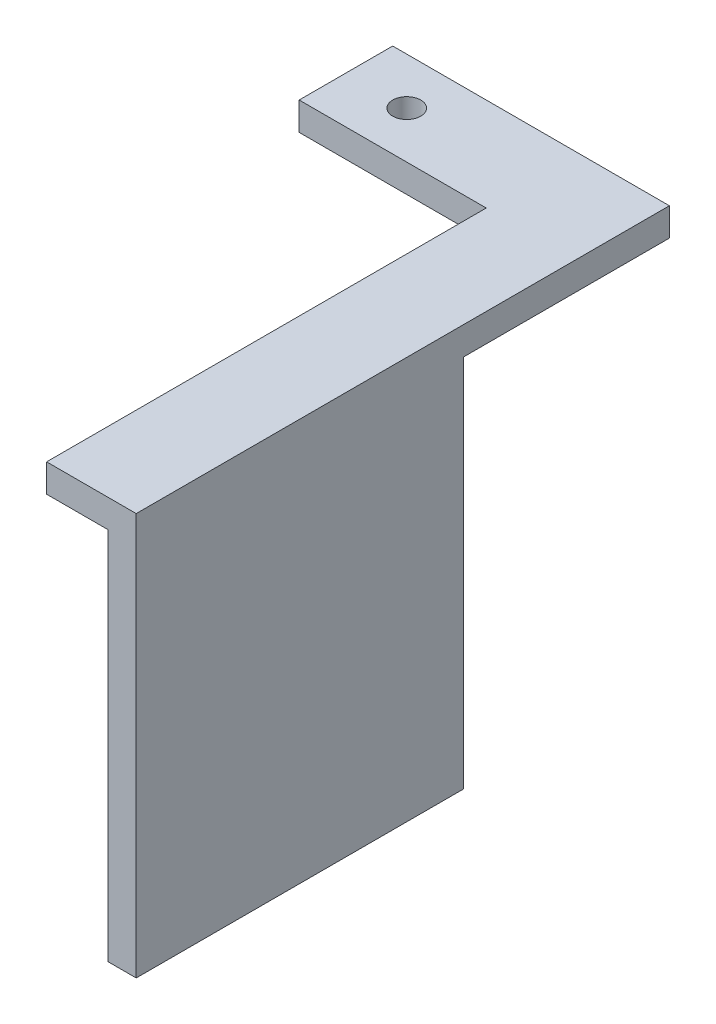
ISO-10303-21;
HEADER;
FILE_DESCRIPTION(('STEP AP214'),'2;1');
FILE_NAME('part.step','',(''),(''),'','','');
FILE_SCHEMA(('AUTOMOTIVE_DESIGN { 1 0 10303 214 1 1 1 1 }'));
ENDSEC;
DATA;
#1=APPLICATION_CONTEXT('core data for automotive mechanical design processes');
#2=APPLICATION_PROTOCOL_DEFINITION('international standard','automotive_design',2000,#1);
#3=PRODUCT_CONTEXT('',#1,'mechanical');
#4=PRODUCT('Part','Part','',(#3));
#5=PRODUCT_RELATED_PRODUCT_CATEGORY('part','',(#4));
#6=PRODUCT_DEFINITION_FORMATION('','',#4);
#7=PRODUCT_DEFINITION_CONTEXT('part definition',#1,'design');
#8=PRODUCT_DEFINITION('design','',#6,#7);
#9=PRODUCT_DEFINITION_SHAPE('','',#8);
#10=(LENGTH_UNIT() NAMED_UNIT(*) SI_UNIT(.MILLI.,.METRE.));
#11=(NAMED_UNIT(*) PLANE_ANGLE_UNIT() SI_UNIT($,.RADIAN.));
#12=(NAMED_UNIT(*) SI_UNIT($,.STERADIAN.) SOLID_ANGLE_UNIT());
#13=UNCERTAINTY_MEASURE_WITH_UNIT(LENGTH_MEASURE(1.E-05),#10,'distance_accuracy_value','');
#14=(GEOMETRIC_REPRESENTATION_CONTEXT(3) GLOBAL_UNCERTAINTY_ASSIGNED_CONTEXT((#13)) GLOBAL_UNIT_ASSIGNED_CONTEXT((#10,
#11,#12)) REPRESENTATION_CONTEXT('',''));
#15=CARTESIAN_POINT('',(0.,0.,0.));
#16=DIRECTION('',(0.,0.,1.));
#17=DIRECTION('',(1.,0.,0.));
#18=AXIS2_PLACEMENT_3D('',#15,#16,#17);
#19=CARTESIAN_POINT('',(0.,0.,0.));
#20=DIRECTION('',(0.,1.,0.));
#21=DIRECTION('',(0.,0.,1.));
#22=AXIS2_PLACEMENT_3D('',#19,#20,#21);
#23=PLANE('',#22);
#24=CARTESIAN_POINT('',(-3.5,0.,0.));
#25=DIRECTION('',(0.,1.,0.));
#26=DIRECTION('',(0.,0.,1.));
#27=AXIS2_PLACEMENT_3D('',#24,#25,#26);
#28=CIRCLE('',#27,1.5);
#29=CARTESIAN_POINT('',(-3.5,0.,1.5));
#30=VERTEX_POINT('',#29);
#31=EDGE_CURVE('E131',#30,#30,#28,.T.);
#32=ORIENTED_EDGE('',*,*,#31,.T.);
#33=EDGE_LOOP('',(#32));
#34=FACE_BOUND('',#33,.T.);
#35=DIRECTION('',(0.,0.,-1.));
#36=VECTOR('',#35,1.);
#37=CARTESIAN_POINT('',(16.57850172,0.,17.));
#38=LINE('',#37,#36);
#39=CARTESIAN_POINT('',(16.57850172,0.,52.));
#40=VERTEX_POINT('',#39);
#41=CARTESIAN_POINT('',(16.57850172,0.,17.));
#42=VERTEX_POINT('',#41);
#43=EDGE_CURVE('E56',#40,#42,#38,.T.);
#44=ORIENTED_EDGE('',*,*,#43,.F.);
#45=DIRECTION('',(1.,0.,0.));
#46=VECTOR('',#45,1.);
#47=CARTESIAN_POINT('',(10.,0.,52.));
#48=LINE('',#47,#46);
#49=CARTESIAN_POINT('',(10.,0.,52.));
#50=VERTEX_POINT('',#49);
#51=EDGE_CURVE('E161',#50,#40,#48,.T.);
#52=ORIENTED_EDGE('',*,*,#51,.F.);
#53=DIRECTION('',(0.,0.,1.));
#54=VECTOR('',#53,1.);
#55=CARTESIAN_POINT('',(10.,0.,5.));
#56=LINE('',#55,#54);
#57=CARTESIAN_POINT('',(10.,0.,5.));
#58=VERTEX_POINT('',#57);
#59=EDGE_CURVE('E159',#58,#50,#56,.T.);
#60=ORIENTED_EDGE('',*,*,#59,.F.);
#61=DIRECTION('',(1.,0.,0.));
#62=VECTOR('',#61,1.);
#63=CARTESIAN_POINT('',(10.,0.,5.));
#64=LINE('',#63,#62);
#65=CARTESIAN_POINT('',(-10.,0.,5.));
#66=VERTEX_POINT('',#65);
#67=EDGE_CURVE('E157',#66,#58,#64,.T.);
#68=ORIENTED_EDGE('',*,*,#67,.F.);
#69=DIRECTION('',(0.,0.,1.));
#70=VECTOR('',#69,1.);
#71=CARTESIAN_POINT('',(-10.,0.,5.));
#72=LINE('',#71,#70);
#73=CARTESIAN_POINT('',(-10.,0.,-5.));
#74=VERTEX_POINT('',#73);
#75=EDGE_CURVE('E138',#74,#66,#72,.T.);
#76=ORIENTED_EDGE('',*,*,#75,.F.);
#77=DIRECTION('',(-1.,0.,0.));
#78=VECTOR('',#77,1.);
#79=CARTESIAN_POINT('',(10.,0.,-5.));
#80=LINE('',#79,#78);
#81=CARTESIAN_POINT('',(19.57850172,0.,-5.));
#82=VERTEX_POINT('',#81);
#83=EDGE_CURVE('E144',#82,#74,#80,.T.);
#84=ORIENTED_EDGE('',*,*,#83,.F.);
#85=DIRECTION('',(0.,0.,-1.));
#86=VECTOR('',#85,1.);
#87=CARTESIAN_POINT('',(19.57850172,0.,52.));
#88=LINE('',#87,#86);
#89=CARTESIAN_POINT('',(19.57850172,0.,17.));
#90=VERTEX_POINT('',#89);
#91=EDGE_CURVE('E163',#90,#82,#88,.T.);
#92=ORIENTED_EDGE('',*,*,#91,.F.);
#93=DIRECTION('',(1.,0.,0.));
#94=VECTOR('',#93,1.);
#95=CARTESIAN_POINT('',(19.57850172,0.,17.));
#96=LINE('',#95,#94);
#97=EDGE_CURVE('E51',#42,#90,#96,.T.);
#98=ORIENTED_EDGE('',*,*,#97,.F.);
#99=EDGE_LOOP('',(#44,#52,#60,#68,#76,#84,#92,#98));
#100=FACE_BOUND('',#99,.T.);
#101=ADVANCED_FACE('F36',(#34,#100),#23,.F.);
#102=CARTESIAN_POINT('',(-10.,3.,5.));
#103=DIRECTION('',(1.,0.,0.));
#104=DIRECTION('',(0.,0.,-1.));
#105=AXIS2_PLACEMENT_3D('',#102,#103,#104);
#106=PLANE('',#105);
#107=ORIENTED_EDGE('',*,*,#75,.T.);
#108=DIRECTION('',(0.,-1.,0.));
#109=VECTOR('',#108,1.);
#110=CARTESIAN_POINT('',(-10.,3.,5.));
#111=LINE('',#110,#109);
#112=CARTESIAN_POINT('',(-10.,3.,5.));
#113=VERTEX_POINT('',#112);
#114=EDGE_CURVE('E11',#113,#66,#111,.T.);
#115=ORIENTED_EDGE('',*,*,#114,.F.);
#116=DIRECTION('',(0.,0.,1.));
#117=VECTOR('',#116,1.);
#118=CARTESIAN_POINT('',(-10.,3.,5.));
#119=LINE('',#118,#117);
#120=CARTESIAN_POINT('',(-10.,3.,-5.));
#121=VERTEX_POINT('',#120);
#122=EDGE_CURVE('E140',#121,#113,#119,.T.);
#123=ORIENTED_EDGE('',*,*,#122,.F.);
#124=DIRECTION('',(0.,-1.,0.));
#125=VECTOR('',#124,1.);
#126=CARTESIAN_POINT('',(-10.,3.,-5.));
#127=LINE('',#126,#125);
#128=EDGE_CURVE('E154',#121,#74,#127,.T.);
#129=ORIENTED_EDGE('',*,*,#128,.T.);
#130=EDGE_LOOP('',(#107,#115,#123,#129));
#131=FACE_BOUND('',#130,.T.);
#132=ADVANCED_FACE('F38',(#131),#106,.F.);
#133=CARTESIAN_POINT('',(10.,3.,5.));
#134=DIRECTION('',(0.,0.,-1.));
#135=DIRECTION('',(-1.,0.,0.));
#136=AXIS2_PLACEMENT_3D('',#133,#134,#135);
#137=PLANE('',#136);
#138=ORIENTED_EDGE('',*,*,#67,.T.);
#139=DIRECTION('',(0.,-1.,0.));
#140=VECTOR('',#139,1.);
#141=CARTESIAN_POINT('',(10.,3.,5.));
#142=LINE('',#141,#140);
#143=CARTESIAN_POINT('',(10.,3.,5.));
#144=VERTEX_POINT('',#143);
#145=EDGE_CURVE('E44',#144,#58,#142,.T.);
#146=ORIENTED_EDGE('',*,*,#145,.F.);
#147=DIRECTION('',(1.,0.,0.));
#148=VECTOR('',#147,1.);
#149=CARTESIAN_POINT('',(10.,3.,5.));
#150=LINE('',#149,#148);
#151=EDGE_CURVE('E143',#113,#144,#150,.T.);
#152=ORIENTED_EDGE('',*,*,#151,.F.);
#153=ORIENTED_EDGE('',*,*,#114,.T.);
#154=EDGE_LOOP('',(#138,#146,#152,#153));
#155=FACE_BOUND('',#154,.T.);
#156=ADVANCED_FACE('F202',(#155),#137,.F.);
#157=CARTESIAN_POINT('',(10.,3.,5.));
#158=DIRECTION('',(1.,0.,0.));
#159=DIRECTION('',(0.,0.,-1.));
#160=AXIS2_PLACEMENT_3D('',#157,#158,#159);
#161=PLANE('',#160);
#162=ORIENTED_EDGE('',*,*,#59,.T.);
#163=DIRECTION('',(0.,-1.,0.));
#164=VECTOR('',#163,1.);
#165=CARTESIAN_POINT('',(10.,3.,52.));
#166=LINE('',#165,#164);
#167=CARTESIAN_POINT('',(10.,3.,52.));
#168=VERTEX_POINT('',#167);
#169=EDGE_CURVE('E173',#168,#50,#166,.T.);
#170=ORIENTED_EDGE('',*,*,#169,.F.);
#171=DIRECTION('',(0.,0.,1.));
#172=VECTOR('',#171,1.);
#173=CARTESIAN_POINT('',(10.,3.,5.));
#174=LINE('',#173,#172);
#175=EDGE_CURVE('E146',#144,#168,#174,.T.);
#176=ORIENTED_EDGE('',*,*,#175,.F.);
#177=ORIENTED_EDGE('',*,*,#145,.T.);
#178=EDGE_LOOP('',(#162,#170,#176,#177));
#179=FACE_BOUND('',#178,.T.);
#180=ADVANCED_FACE('F180',(#179),#161,.F.);
#181=CARTESIAN_POINT('',(10.,3.,52.));
#182=DIRECTION('',(0.,0.,-1.));
#183=DIRECTION('',(-1.,0.,0.));
#184=AXIS2_PLACEMENT_3D('',#181,#182,#183);
#185=PLANE('',#184);
#186=ORIENTED_EDGE('',*,*,#51,.T.);
#187=DIRECTION('',(0.,1.,0.));
#188=VECTOR('',#187,1.);
#189=CARTESIAN_POINT('',(16.57850172,-40.,52.));
#190=LINE('',#189,#188);
#191=CARTESIAN_POINT('',(16.57850172,-40.,52.));
#192=VERTEX_POINT('',#191);
#193=EDGE_CURVE('E133',#192,#40,#190,.T.);
#194=ORIENTED_EDGE('',*,*,#193,.F.);
#195=DIRECTION('',(-1.,0.,0.));
#196=VECTOR('',#195,1.);
#197=CARTESIAN_POINT('',(19.57850172,-40.,52.));
#198=LINE('',#197,#196);
#199=CARTESIAN_POINT('',(19.57850172,-40.,52.));
#200=VERTEX_POINT('',#199);
#201=EDGE_CURVE('E122',#200,#192,#198,.T.);
#202=ORIENTED_EDGE('',*,*,#201,.F.);
#203=DIRECTION('',(0.,-1.,0.));
#204=VECTOR('',#203,1.);
#205=CARTESIAN_POINT('',(19.57850172,3.,52.));
#206=LINE('',#205,#204);
#207=CARTESIAN_POINT('',(19.57850172,3.,52.));
#208=VERTEX_POINT('',#207);
#209=EDGE_CURVE('E171',#208,#200,#206,.T.);
#210=ORIENTED_EDGE('',*,*,#209,.F.);
#211=DIRECTION('',(1.,0.,0.));
#212=VECTOR('',#211,1.);
#213=CARTESIAN_POINT('',(10.,3.,52.));
#214=LINE('',#213,#212);
#215=EDGE_CURVE('E148',#168,#208,#214,.T.);
#216=ORIENTED_EDGE('',*,*,#215,.F.);
#217=ORIENTED_EDGE('',*,*,#169,.T.);
#218=EDGE_LOOP('',(#186,#194,#202,#210,#216,#217));
#219=FACE_BOUND('',#218,.T.);
#220=ADVANCED_FACE('F185',(#219),#185,.F.);
#221=CARTESIAN_POINT('',(19.57850172,3.,52.));
#222=DIRECTION('',(-1.,0.,0.));
#223=DIRECTION('',(0.,0.,1.));
#224=AXIS2_PLACEMENT_3D('',#221,#222,#223);
#225=PLANE('',#224);
#226=ORIENTED_EDGE('',*,*,#209,.T.);
#227=DIRECTION('',(0.,0.,1.));
#228=VECTOR('',#227,1.);
#229=CARTESIAN_POINT('',(19.57850172,-40.,17.));
#230=LINE('',#229,#228);
#231=CARTESIAN_POINT('',(19.57850172,-40.,17.));
#232=VERTEX_POINT('',#231);
#233=EDGE_CURVE('E116',#232,#200,#230,.T.);
#234=ORIENTED_EDGE('',*,*,#233,.F.);
#235=DIRECTION('',(0.,1.,0.));
#236=VECTOR('',#235,1.);
#237=CARTESIAN_POINT('',(19.57850172,-40.,17.));
#238=LINE('',#237,#236);
#239=EDGE_CURVE('E112',#232,#90,#238,.T.);
#240=ORIENTED_EDGE('',*,*,#239,.T.);
#241=ORIENTED_EDGE('',*,*,#91,.T.);
#242=DIRECTION('',(0.,-1.,0.));
#243=VECTOR('',#242,1.);
#244=CARTESIAN_POINT('',(19.57850172,3.,-5.));
#245=LINE('',#244,#243);
#246=CARTESIAN_POINT('',(19.57850172,3.,-5.));
#247=VERTEX_POINT('',#246);
#248=EDGE_CURVE('E168',#247,#82,#245,.T.);
#249=ORIENTED_EDGE('',*,*,#248,.F.);
#250=DIRECTION('',(0.,0.,-1.));
#251=VECTOR('',#250,1.);
#252=CARTESIAN_POINT('',(19.57850172,3.,52.));
#253=LINE('',#252,#251);
#254=EDGE_CURVE('E150',#208,#247,#253,.T.);
#255=ORIENTED_EDGE('',*,*,#254,.F.);
#256=EDGE_LOOP('',(#226,#234,#240,#241,#249,#255));
#257=FACE_BOUND('',#256,.T.);
#258=ADVANCED_FACE('F195',(#257),#225,.F.);
#259=CARTESIAN_POINT('',(10.,3.,-5.));
#260=DIRECTION('',(0.,0.,1.));
#261=DIRECTION('',(1.,0.,0.));
#262=AXIS2_PLACEMENT_3D('',#259,#260,#261);
#263=PLANE('',#262);
#264=ORIENTED_EDGE('',*,*,#83,.T.);
#265=ORIENTED_EDGE('',*,*,#128,.F.);
#266=DIRECTION('',(-1.,0.,0.));
#267=VECTOR('',#266,1.);
#268=CARTESIAN_POINT('',(19.57850172,3.,-5.));
#269=LINE('',#268,#267);
#270=EDGE_CURVE('E152',#247,#121,#269,.T.);
#271=ORIENTED_EDGE('',*,*,#270,.F.);
#272=ORIENTED_EDGE('',*,*,#248,.T.);
#273=EDGE_LOOP('',(#264,#265,#271,#272));
#274=FACE_BOUND('',#273,.T.);
#275=ADVANCED_FACE('F206',(#274),#263,.F.);
#276=CARTESIAN_POINT('',(0.,3.,0.));
#277=DIRECTION('',(0.,1.,0.));
#278=DIRECTION('',(0.,0.,1.));
#279=AXIS2_PLACEMENT_3D('',#276,#277,#278);
#280=PLANE('',#279);
#281=CARTESIAN_POINT('',(-3.5,3.,0.));
#282=DIRECTION('',(0.,1.,0.));
#283=DIRECTION('',(0.,0.,1.));
#284=AXIS2_PLACEMENT_3D('',#281,#282,#283);
#285=CIRCLE('',#284,1.5);
#286=CARTESIAN_POINT('',(-3.5,3.,1.5));
#287=VERTEX_POINT('',#286);
#288=EDGE_CURVE('E128',#287,#287,#285,.T.);
#289=ORIENTED_EDGE('',*,*,#288,.F.);
#290=EDGE_LOOP('',(#289));
#291=FACE_BOUND('',#290,.T.);
#292=ORIENTED_EDGE('',*,*,#122,.T.);
#293=ORIENTED_EDGE('',*,*,#151,.T.);
#294=ORIENTED_EDGE('',*,*,#175,.T.);
#295=ORIENTED_EDGE('',*,*,#215,.T.);
#296=ORIENTED_EDGE('',*,*,#254,.T.);
#297=ORIENTED_EDGE('',*,*,#270,.T.);
#298=EDGE_LOOP('',(#292,#293,#294,#295,#296,#297));
#299=FACE_BOUND('',#298,.T.);
#300=ADVANCED_FACE('F198',(#291,#299),#280,.T.);
#301=CARTESIAN_POINT('',(-3.5,0.,0.));
#302=DIRECTION('',(0.,1.,0.));
#303=DIRECTION('',(0.,0.,1.));
#304=AXIS2_PLACEMENT_3D('',#301,#302,#303);
#305=CYLINDRICAL_SURFACE('',#304,1.5);
#306=ORIENTED_EDGE('',*,*,#31,.F.);
#307=EDGE_LOOP('',(#306));
#308=FACE_BOUND('',#307,.T.);
#309=ORIENTED_EDGE('',*,*,#288,.T.);
#310=EDGE_LOOP('',(#309));
#311=FACE_BOUND('',#310,.T.);
#312=ADVANCED_FACE('F213',(#308,#311),#305,.F.);
#313=CARTESIAN_POINT('',(16.57850172,-40.,17.));
#314=DIRECTION('',(1.,0.,0.));
#315=DIRECTION('',(0.,0.,-1.));
#316=AXIS2_PLACEMENT_3D('',#313,#314,#315);
#317=PLANE('',#316);
#318=ORIENTED_EDGE('',*,*,#43,.T.);
#319=DIRECTION('',(0.,1.,0.));
#320=VECTOR('',#319,1.);
#321=CARTESIAN_POINT('',(16.57850172,-40.,17.));
#322=LINE('',#321,#320);
#323=CARTESIAN_POINT('',(16.57850172,-40.,17.));
#324=VERTEX_POINT('',#323);
#325=EDGE_CURVE('E110',#324,#42,#322,.T.);
#326=ORIENTED_EDGE('',*,*,#325,.F.);
#327=DIRECTION('',(0.,0.,-1.));
#328=VECTOR('',#327,1.);
#329=CARTESIAN_POINT('',(16.57850172,-40.,17.));
#330=LINE('',#329,#328);
#331=EDGE_CURVE('E117',#192,#324,#330,.T.);
#332=ORIENTED_EDGE('',*,*,#331,.F.);
#333=ORIENTED_EDGE('',*,*,#193,.T.);
#334=EDGE_LOOP('',(#318,#326,#332,#333));
#335=FACE_BOUND('',#334,.T.);
#336=ADVANCED_FACE('F127',(#335),#317,.F.);
#337=CARTESIAN_POINT('',(19.57850172,-40.,17.));
#338=DIRECTION('',(0.,0.,1.));
#339=DIRECTION('',(1.,0.,0.));
#340=AXIS2_PLACEMENT_3D('',#337,#338,#339);
#341=PLANE('',#340);
#342=ORIENTED_EDGE('',*,*,#97,.T.);
#343=ORIENTED_EDGE('',*,*,#239,.F.);
#344=DIRECTION('',(1.,0.,0.));
#345=VECTOR('',#344,1.);
#346=CARTESIAN_POINT('',(19.57850172,-40.,17.));
#347=LINE('',#346,#345);
#348=EDGE_CURVE('E106',#324,#232,#347,.T.);
#349=ORIENTED_EDGE('',*,*,#348,.F.);
#350=ORIENTED_EDGE('',*,*,#325,.T.);
#351=EDGE_LOOP('',(#342,#343,#349,#350));
#352=FACE_BOUND('',#351,.T.);
#353=ADVANCED_FACE('F108',(#352),#341,.F.);
#354=CARTESIAN_POINT('',(0.,-40.,0.));
#355=DIRECTION('',(0.,-1.,0.));
#356=DIRECTION('',(0.,0.,-1.));
#357=AXIS2_PLACEMENT_3D('',#354,#355,#356);
#358=PLANE('',#357);
#359=ORIENTED_EDGE('',*,*,#331,.T.);
#360=ORIENTED_EDGE('',*,*,#348,.T.);
#361=ORIENTED_EDGE('',*,*,#233,.T.);
#362=ORIENTED_EDGE('',*,*,#201,.T.);
#363=EDGE_LOOP('',(#359,#360,#361,#362));
#364=FACE_BOUND('',#363,.T.);
#365=ADVANCED_FACE('F120',(#364),#358,.T.);
#366=CLOSED_SHELL('',(#101,#132,#156,#180,#220,#258,#275,#300,#312,#336,#353,#365));
#367=MANIFOLD_SOLID_BREP('B2',#366);
#368=ADVANCED_BREP_SHAPE_REPRESENTATION('',(#18,#367),#14);
#369=SHAPE_DEFINITION_REPRESENTATION(#9,#368);
ENDSEC;
END-ISO-10303-21;
